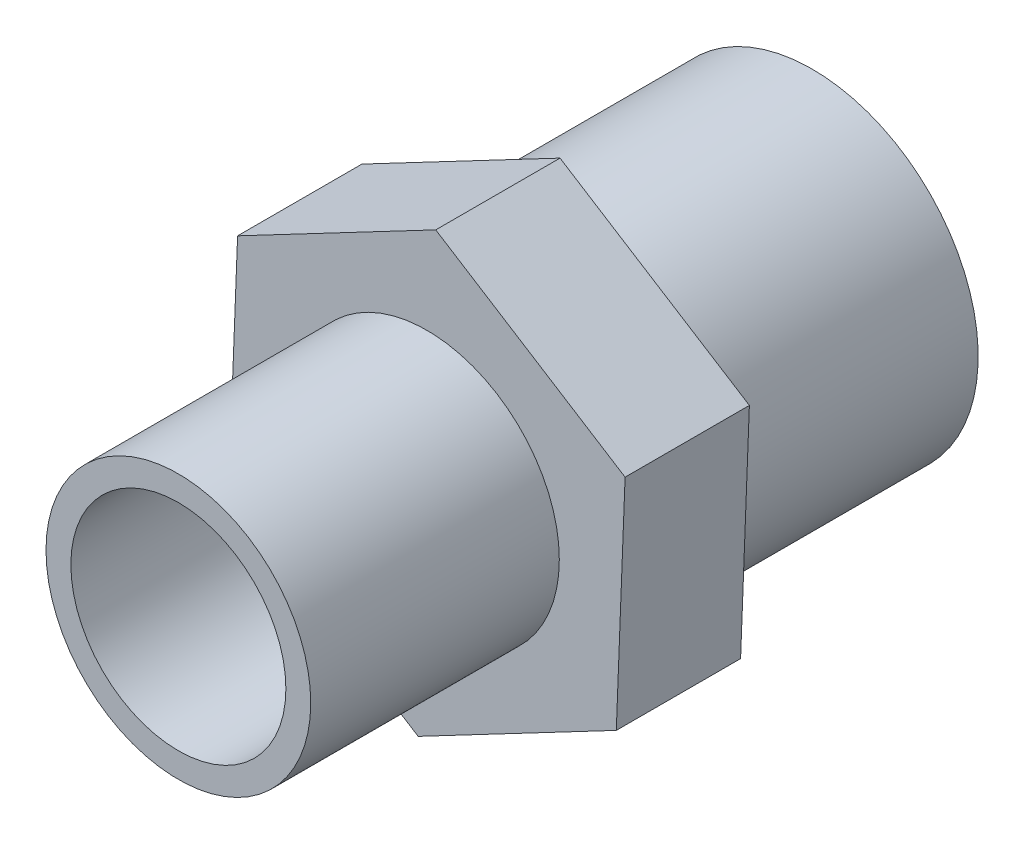
ISO-10303-21;
HEADER;
FILE_DESCRIPTION(('STEP AP214'),'2;1');
FILE_NAME('part.step','',(''),(''),'','','');
FILE_SCHEMA(('AUTOMOTIVE_DESIGN { 1 0 10303 214 1 1 1 1 }'));
ENDSEC;
DATA;
#1=APPLICATION_CONTEXT('core data for automotive mechanical design processes');
#2=APPLICATION_PROTOCOL_DEFINITION('international standard','automotive_design',2000,#1);
#3=PRODUCT_CONTEXT('',#1,'mechanical');
#4=PRODUCT('Part','Part','',(#3));
#5=PRODUCT_RELATED_PRODUCT_CATEGORY('part','',(#4));
#6=PRODUCT_DEFINITION_FORMATION('','',#4);
#7=PRODUCT_DEFINITION_CONTEXT('part definition',#1,'design');
#8=PRODUCT_DEFINITION('design','',#6,#7);
#9=PRODUCT_DEFINITION_SHAPE('','',#8);
#10=(LENGTH_UNIT() NAMED_UNIT(*) SI_UNIT(.MILLI.,.METRE.));
#11=(NAMED_UNIT(*) PLANE_ANGLE_UNIT() SI_UNIT($,.RADIAN.));
#12=(NAMED_UNIT(*) SI_UNIT($,.STERADIAN.) SOLID_ANGLE_UNIT());
#13=UNCERTAINTY_MEASURE_WITH_UNIT(LENGTH_MEASURE(1.E-05),#10,'distance_accuracy_value','');
#14=(GEOMETRIC_REPRESENTATION_CONTEXT(3) GLOBAL_UNCERTAINTY_ASSIGNED_CONTEXT((#13)) GLOBAL_UNIT_ASSIGNED_CONTEXT((#10,
#11,#12)) REPRESENTATION_CONTEXT('',''));
#15=CARTESIAN_POINT('',(0.,0.,0.));
#16=DIRECTION('',(0.,0.,1.));
#17=DIRECTION('',(1.,0.,0.));
#18=AXIS2_PLACEMENT_3D('',#15,#16,#17);
#19=CARTESIAN_POINT('',(15.2347430276917,-9.6126510357823,18.));
#20=DIRECTION('',(-0.999228586353057,0.0392712644928924,0.));
#21=DIRECTION('',(-0.0392712644928924,-0.999228586353057,0.));
#22=AXIS2_PLACEMENT_3D('',#19,#20,#21);
#23=PLANE('',#22);
#24=DIRECTION('',(0.0392712644928924,0.999228586353057,0.));
#25=VECTOR('',#24,1.);
#26=CARTESIAN_POINT('',(15.2347430276917,-9.6126510357823,8.));
#27=LINE('',#26,#25);
#28=CARTESIAN_POINT('',(15.2347430276917,-9.6126510357823,8.));
#29=VERTEX_POINT('',#28);
#30=CARTESIAN_POINT('',(15.9421715085481,8.38734896421769,8.));
#31=VERTEX_POINT('',#30);
#32=EDGE_CURVE('E142',#29,#31,#27,.T.);
#33=ORIENTED_EDGE('',*,*,#32,.T.);
#34=DIRECTION('',(0.,0.,-1.));
#35=VECTOR('',#34,1.);
#36=CARTESIAN_POINT('',(15.9421715085481,8.38734896421769,18.));
#37=LINE('',#36,#35);
#38=CARTESIAN_POINT('',(15.9421715085481,8.38734896421769,18.));
#39=VERTEX_POINT('',#38);
#40=EDGE_CURVE('E170',#39,#31,#37,.T.);
#41=ORIENTED_EDGE('',*,*,#40,.F.);
#42=DIRECTION('',(0.0392712644928924,0.999228586353057,0.));
#43=VECTOR('',#42,1.);
#44=CARTESIAN_POINT('',(15.2347430276917,-9.6126510357823,18.));
#45=LINE('',#44,#43);
#46=CARTESIAN_POINT('',(15.2347430276917,-9.6126510357823,18.));
#47=VERTEX_POINT('',#46);
#48=EDGE_CURVE('E159',#47,#39,#45,.T.);
#49=ORIENTED_EDGE('',*,*,#48,.F.);
#50=DIRECTION('',(0.,0.,-1.));
#51=VECTOR('',#50,1.);
#52=CARTESIAN_POINT('',(15.2347430276917,-9.6126510357823,18.));
#53=LINE('',#52,#51);
#54=EDGE_CURVE('E138',#47,#29,#53,.T.);
#55=ORIENTED_EDGE('',*,*,#54,.T.);
#56=EDGE_LOOP('',(#33,#41,#49,#55));
#57=FACE_BOUND('',#56,.T.);
#58=ADVANCED_FACE('F51',(#57),#23,.F.);
#59=CARTESIAN_POINT('',(15.9421715085481,8.38734896421769,18.));
#60=DIRECTION('',(-0.533624205866111,-0.845721707722914,0.));
#61=DIRECTION('',(0.845721707722914,-0.533624205866111,0.));
#62=AXIS2_PLACEMENT_3D('',#59,#60,#61);
#63=PLANE('',#62);
#64=DIRECTION('',(-0.845721707722914,0.533624205866111,0.));
#65=VECTOR('',#64,1.);
#66=CARTESIAN_POINT('',(15.9421715085481,8.38734896421769,8.));
#67=LINE('',#66,#65);
#68=CARTESIAN_POINT('',(0.707428480856438,18.,8.));
#69=VERTEX_POINT('',#68);
#70=EDGE_CURVE('E146',#31,#69,#67,.T.);
#71=ORIENTED_EDGE('',*,*,#70,.T.);
#72=DIRECTION('',(0.,0.,-1.));
#73=VECTOR('',#72,1.);
#74=CARTESIAN_POINT('',(0.707428480856438,18.,18.));
#75=LINE('',#74,#73);
#76=CARTESIAN_POINT('',(0.707428480856438,18.,18.));
#77=VERTEX_POINT('',#76);
#78=EDGE_CURVE('E166',#77,#69,#75,.T.);
#79=ORIENTED_EDGE('',*,*,#78,.F.);
#80=DIRECTION('',(-0.845721707722914,0.533624205866111,0.));
#81=VECTOR('',#80,1.);
#82=CARTESIAN_POINT('',(15.9421715085481,8.38734896421769,18.));
#83=LINE('',#82,#81);
#84=EDGE_CURVE('E107',#39,#77,#83,.T.);
#85=ORIENTED_EDGE('',*,*,#84,.F.);
#86=ORIENTED_EDGE('',*,*,#40,.T.);
#87=EDGE_LOOP('',(#71,#79,#85,#86));
#88=FACE_BOUND('',#87,.T.);
#89=ADVANCED_FACE('F209',(#88),#63,.F.);
#90=CARTESIAN_POINT('',(0.707428480856438,18.,18.));
#91=DIRECTION('',(0.465604380486946,-0.884992972215807,0.));
#92=DIRECTION('',(0.884992972215807,0.465604380486946,0.));
#93=AXIS2_PLACEMENT_3D('',#90,#91,#92);
#94=PLANE('',#93);
#95=DIRECTION('',(-0.884992972215806,-0.465604380486946,0.));
#96=VECTOR('',#95,1.);
#97=CARTESIAN_POINT('',(0.707428480856438,18.,8.));
#98=LINE('',#97,#96);
#99=CARTESIAN_POINT('',(-15.2347430276917,9.6126510357823,8.));
#100=VERTEX_POINT('',#99);
#101=EDGE_CURVE('E150',#69,#100,#98,.T.);
#102=ORIENTED_EDGE('',*,*,#101,.T.);
#103=DIRECTION('',(0.,0.,-1.));
#104=VECTOR('',#103,1.);
#105=CARTESIAN_POINT('',(-15.2347430276917,9.6126510357823,18.));
#106=LINE('',#105,#104);
#107=CARTESIAN_POINT('',(-15.2347430276917,9.6126510357823,18.));
#108=VERTEX_POINT('',#107);
#109=EDGE_CURVE('E131',#108,#100,#106,.T.);
#110=ORIENTED_EDGE('',*,*,#109,.F.);
#111=DIRECTION('',(-0.884992972215806,-0.465604380486946,0.));
#112=VECTOR('',#111,1.);
#113=CARTESIAN_POINT('',(0.707428480856438,18.,18.));
#114=LINE('',#113,#112);
#115=EDGE_CURVE('E120',#77,#108,#114,.T.);
#116=ORIENTED_EDGE('',*,*,#115,.F.);
#117=ORIENTED_EDGE('',*,*,#78,.T.);
#118=EDGE_LOOP('',(#102,#110,#116,#117));
#119=FACE_BOUND('',#118,.T.);
#120=ADVANCED_FACE('F215',(#119),#94,.F.);
#121=CARTESIAN_POINT('',(-15.2347430276917,9.6126510357823,18.));
#122=DIRECTION('',(0.999228586353057,-0.0392712644928927,0.));
#123=DIRECTION('',(0.0392712644928927,0.999228586353057,0.));
#124=AXIS2_PLACEMENT_3D('',#121,#122,#123);
#125=PLANE('',#124);
#126=DIRECTION('',(-0.0392712644928927,-0.999228586353057,0.));
#127=VECTOR('',#126,1.);
#128=CARTESIAN_POINT('',(-15.2347430276917,9.6126510357823,8.));
#129=LINE('',#128,#127);
#130=CARTESIAN_POINT('',(-15.9421715085481,-8.38734896421769,8.));
#131=VERTEX_POINT('',#130);
#132=EDGE_CURVE('E129',#100,#131,#129,.T.);
#133=ORIENTED_EDGE('',*,*,#132,.T.);
#134=DIRECTION('',(0.,0.,-1.));
#135=VECTOR('',#134,1.);
#136=CARTESIAN_POINT('',(-15.9421715085481,-8.38734896421769,18.));
#137=LINE('',#136,#135);
#138=CARTESIAN_POINT('',(-15.9421715085481,-8.38734896421769,18.));
#139=VERTEX_POINT('',#138);
#140=EDGE_CURVE('E126',#139,#131,#137,.T.);
#141=ORIENTED_EDGE('',*,*,#140,.F.);
#142=DIRECTION('',(-0.0392712644928927,-0.999228586353057,0.));
#143=VECTOR('',#142,1.);
#144=CARTESIAN_POINT('',(-15.2347430276917,9.6126510357823,18.));
#145=LINE('',#144,#143);
#146=EDGE_CURVE('E114',#108,#139,#145,.T.);
#147=ORIENTED_EDGE('',*,*,#146,.F.);
#148=ORIENTED_EDGE('',*,*,#109,.T.);
#149=EDGE_LOOP('',(#133,#141,#147,#148));
#150=FACE_BOUND('',#149,.T.);
#151=ADVANCED_FACE('F127',(#150),#125,.F.);
#152=CARTESIAN_POINT('',(-15.9421715085481,-8.38734896421769,18.));
#153=DIRECTION('',(0.533624205866111,0.845721707722914,0.));
#154=DIRECTION('',(-0.845721707722914,0.533624205866111,0.));
#155=AXIS2_PLACEMENT_3D('',#152,#153,#154);
#156=PLANE('',#155);
#157=DIRECTION('',(0.845721707722914,-0.533624205866111,0.));
#158=VECTOR('',#157,1.);
#159=CARTESIAN_POINT('',(-15.9421715085481,-8.38734896421769,8.));
#160=LINE('',#159,#158);
#161=CARTESIAN_POINT('',(-0.707428480856429,-18.,8.));
#162=VERTEX_POINT('',#161);
#163=EDGE_CURVE('E92',#131,#162,#160,.T.);
#164=ORIENTED_EDGE('',*,*,#163,.T.);
#165=DIRECTION('',(0.,0.,-1.));
#166=VECTOR('',#165,1.);
#167=CARTESIAN_POINT('',(-0.707428480856429,-18.,18.));
#168=LINE('',#167,#166);
#169=CARTESIAN_POINT('',(-0.707428480856429,-18.,18.));
#170=VERTEX_POINT('',#169);
#171=EDGE_CURVE('E132',#170,#162,#168,.T.);
#172=ORIENTED_EDGE('',*,*,#171,.F.);
#173=DIRECTION('',(0.845721707722914,-0.533624205866111,0.));
#174=VECTOR('',#173,1.);
#175=CARTESIAN_POINT('',(-15.9421715085481,-8.38734896421769,18.));
#176=LINE('',#175,#174);
#177=EDGE_CURVE('E118',#139,#170,#176,.T.);
#178=ORIENTED_EDGE('',*,*,#177,.F.);
#179=ORIENTED_EDGE('',*,*,#140,.T.);
#180=EDGE_LOOP('',(#164,#172,#178,#179));
#181=FACE_BOUND('',#180,.T.);
#182=ADVANCED_FACE('F134',(#181),#156,.F.);
#183=CARTESIAN_POINT('',(-0.707428480856429,-18.,18.));
#184=DIRECTION('',(-0.465604380486946,0.884992972215807,0.));
#185=DIRECTION('',(-0.884992972215807,-0.465604380486946,0.));
#186=AXIS2_PLACEMENT_3D('',#183,#184,#185);
#187=PLANE('',#186);
#188=DIRECTION('',(0.884992972215806,0.465604380486946,0.));
#189=VECTOR('',#188,1.);
#190=CARTESIAN_POINT('',(-0.707428480856429,-18.,8.));
#191=LINE('',#190,#189);
#192=EDGE_CURVE('E98',#162,#29,#191,.T.);
#193=ORIENTED_EDGE('',*,*,#192,.T.);
#194=ORIENTED_EDGE('',*,*,#54,.F.);
#195=DIRECTION('',(0.884992972215806,0.465604380486946,0.));
#196=VECTOR('',#195,1.);
#197=CARTESIAN_POINT('',(-0.707428480856429,-18.,18.));
#198=LINE('',#197,#196);
#199=EDGE_CURVE('E69',#170,#47,#198,.T.);
#200=ORIENTED_EDGE('',*,*,#199,.F.);
#201=ORIENTED_EDGE('',*,*,#171,.T.);
#202=EDGE_LOOP('',(#193,#194,#200,#201));
#203=FACE_BOUND('',#202,.T.);
#204=ADVANCED_FACE('F237',(#203),#187,.F.);
#205=CARTESIAN_POINT('',(0.,0.,18.));
#206=DIRECTION('',(0.,0.,1.));
#207=DIRECTION('',(1.,0.,0.));
#208=AXIS2_PLACEMENT_3D('',#205,#206,#207);
#209=PLANE('',#208);
#210=CARTESIAN_POINT('',(0.,0.,18.));
#211=DIRECTION('',(0.,0.,1.));
#212=DIRECTION('',(1.,0.,0.));
#213=AXIS2_PLACEMENT_3D('',#210,#211,#212);
#214=CIRCLE('',#213,10.65);
#215=CARTESIAN_POINT('',(10.65,0.,18.));
#216=VERTEX_POINT('',#215);
#217=EDGE_CURVE('E258',#216,#216,#214,.T.);
#218=ORIENTED_EDGE('',*,*,#217,.F.);
#219=EDGE_LOOP('',(#218));
#220=FACE_BOUND('',#219,.T.);
#221=ORIENTED_EDGE('',*,*,#48,.T.);
#222=ORIENTED_EDGE('',*,*,#84,.T.);
#223=ORIENTED_EDGE('',*,*,#115,.T.);
#224=ORIENTED_EDGE('',*,*,#146,.T.);
#225=ORIENTED_EDGE('',*,*,#177,.T.);
#226=ORIENTED_EDGE('',*,*,#199,.T.);
#227=EDGE_LOOP('',(#221,#222,#223,#224,#225,#226));
#228=FACE_BOUND('',#227,.T.);
#229=ADVANCED_FACE('F116',(#220,#228),#209,.T.);
#230=CARTESIAN_POINT('',(0.,0.,8.));
#231=DIRECTION('',(0.,0.,1.));
#232=DIRECTION('',(1.,0.,0.));
#233=AXIS2_PLACEMENT_3D('',#230,#231,#232);
#234=PLANE('',#233);
#235=CARTESIAN_POINT('',(0.,0.,8.));
#236=DIRECTION('',(0.,0.,1.));
#237=DIRECTION('',(1.,0.,0.));
#238=AXIS2_PLACEMENT_3D('',#235,#236,#237);
#239=CIRCLE('',#238,13.35);
#240=CARTESIAN_POINT('',(-13.35,0.,8.));
#241=VERTEX_POINT('',#240);
#242=EDGE_CURVE('E61',#241,#241,#239,.T.);
#243=ORIENTED_EDGE('',*,*,#242,.T.);
#244=EDGE_LOOP('',(#243));
#245=FACE_BOUND('',#244,.T.);
#246=ORIENTED_EDGE('',*,*,#32,.F.);
#247=ORIENTED_EDGE('',*,*,#192,.F.);
#248=ORIENTED_EDGE('',*,*,#163,.F.);
#249=ORIENTED_EDGE('',*,*,#132,.F.);
#250=ORIENTED_EDGE('',*,*,#101,.F.);
#251=ORIENTED_EDGE('',*,*,#70,.F.);
#252=EDGE_LOOP('',(#246,#247,#248,#249,#250,#251));
#253=FACE_BOUND('',#252,.T.);
#254=ADVANCED_FACE('F195',(#245,#253),#234,.F.);
#255=CARTESIAN_POINT('',(0.,0.,13.));
#256=DIRECTION('',(0.,0.,-1.));
#257=DIRECTION('',(-1.,0.,0.));
#258=AXIS2_PLACEMENT_3D('',#255,#256,#257);
#259=CYLINDRICAL_SURFACE('',#258,13.35);
#260=CARTESIAN_POINT('',(0.,0.,-13.));
#261=DIRECTION('',(0.,0.,1.));
#262=DIRECTION('',(1.,0.,0.));
#263=AXIS2_PLACEMENT_3D('',#260,#261,#262);
#264=CIRCLE('',#263,13.35);
#265=CARTESIAN_POINT('',(-13.35,0.,-13.));
#266=VERTEX_POINT('',#265);
#267=EDGE_CURVE('E177',#266,#266,#264,.T.);
#268=CARTESIAN_POINT('',(-13.35,0.,-13.));
#269=CARTESIAN_POINT('',(-13.35,0.,-12.78125));
#270=CARTESIAN_POINT('',(-13.35,0.,-12.5625));
#271=CARTESIAN_POINT('',(-13.35,0.,-12.125));
#272=CARTESIAN_POINT('',(-13.35,0.,-11.90625));
#273=CARTESIAN_POINT('',(-13.35,0.,-11.46875));
#274=CARTESIAN_POINT('',(-13.35,0.,-11.25));
#275=CARTESIAN_POINT('',(-13.35,0.,-10.8125));
#276=CARTESIAN_POINT('',(-13.35,0.,-10.59375));
#277=CARTESIAN_POINT('',(-13.35,0.,-10.15625));
#278=CARTESIAN_POINT('',(-13.35,0.,-9.9375));
#279=CARTESIAN_POINT('',(-13.35,0.,-9.5));
#280=CARTESIAN_POINT('',(-13.35,0.,-9.28125));
#281=CARTESIAN_POINT('',(-13.35,0.,-8.84375));
#282=CARTESIAN_POINT('',(-13.35,0.,-8.625));
#283=CARTESIAN_POINT('',(-13.35,0.,-8.1875));
#284=CARTESIAN_POINT('',(-13.35,0.,-7.96875));
#285=CARTESIAN_POINT('',(-13.35,0.,-7.53125));
#286=CARTESIAN_POINT('',(-13.35,0.,-7.3125));
#287=CARTESIAN_POINT('',(-13.35,0.,-6.875));
#288=CARTESIAN_POINT('',(-13.35,0.,-6.65625));
#289=CARTESIAN_POINT('',(-13.35,0.,-6.21875));
#290=CARTESIAN_POINT('',(-13.35,0.,-6.));
#291=CARTESIAN_POINT('',(-13.35,0.,-5.5625));
#292=CARTESIAN_POINT('',(-13.35,0.,-5.34375));
#293=CARTESIAN_POINT('',(-13.35,0.,-4.90625));
#294=CARTESIAN_POINT('',(-13.35,0.,-4.6875));
#295=CARTESIAN_POINT('',(-13.35,0.,-4.25));
#296=CARTESIAN_POINT('',(-13.35,0.,-4.03125));
#297=CARTESIAN_POINT('',(-13.35,0.,-3.59375));
#298=CARTESIAN_POINT('',(-13.35,0.,-3.375));
#299=CARTESIAN_POINT('',(-13.35,0.,-2.9375));
#300=CARTESIAN_POINT('',(-13.35,0.,-2.71875));
#301=CARTESIAN_POINT('',(-13.35,0.,-2.28125));
#302=CARTESIAN_POINT('',(-13.35,0.,-2.0625));
#303=CARTESIAN_POINT('',(-13.35,0.,-1.625));
#304=CARTESIAN_POINT('',(-13.35,0.,-1.40625));
#305=CARTESIAN_POINT('',(-13.35,0.,-0.968750000000001));
#306=CARTESIAN_POINT('',(-13.35,0.,-0.750000000000001));
#307=CARTESIAN_POINT('',(-13.35,0.,-0.3125));
#308=CARTESIAN_POINT('',(-13.35,0.,-0.0937500000000001));
#309=CARTESIAN_POINT('',(-13.35,0.,0.34375));
#310=CARTESIAN_POINT('',(-13.35,0.,0.562499999999999));
#311=CARTESIAN_POINT('',(-13.35,0.,0.999999999999999));
#312=CARTESIAN_POINT('',(-13.35,0.,1.21875));
#313=CARTESIAN_POINT('',(-13.35,0.,1.65625));
#314=CARTESIAN_POINT('',(-13.35,0.,1.875));
#315=CARTESIAN_POINT('',(-13.35,0.,2.3125));
#316=CARTESIAN_POINT('',(-13.35,0.,2.53125));
#317=CARTESIAN_POINT('',(-13.35,0.,2.96875));
#318=CARTESIAN_POINT('',(-13.35,0.,3.1875));
#319=CARTESIAN_POINT('',(-13.35,0.,3.625));
#320=CARTESIAN_POINT('',(-13.35,0.,3.84375));
#321=CARTESIAN_POINT('',(-13.35,0.,4.28125));
#322=CARTESIAN_POINT('',(-13.35,0.,4.5));
#323=CARTESIAN_POINT('',(-13.35,0.,4.9375));
#324=CARTESIAN_POINT('',(-13.35,0.,5.15625));
#325=CARTESIAN_POINT('',(-13.35,0.,5.59375));
#326=CARTESIAN_POINT('',(-13.35,0.,5.8125));
#327=CARTESIAN_POINT('',(-13.35,0.,6.25));
#328=CARTESIAN_POINT('',(-13.35,0.,6.46875));
#329=CARTESIAN_POINT('',(-13.35,0.,6.90625));
#330=CARTESIAN_POINT('',(-13.35,0.,7.125));
#331=CARTESIAN_POINT('',(-13.35,0.,7.5625));
#332=CARTESIAN_POINT('',(-13.35,0.,7.78125));
#333=CARTESIAN_POINT('',(-13.35,0.,8.));
#334=B_SPLINE_CURVE_WITH_KNOTS('',3,(#268,#269,#270,#271,#272,#273,#274,#275,#276,#277,#278,
#279,#280,#281,#282,#283,#284,#285,#286,#287,#288,#289,#290,#291,#292,#293,#294,#295,#296,#297,
#298,#299,#300,#301,#302,#303,#304,#305,#306,#307,#308,#309,#310,#311,#312,#313,#314,#315,#316,
#317,#318,#319,#320,#321,#322,#323,#324,#325,#326,#327,#328,#329,#330,#331,#332,#333),
.UNSPECIFIED.,.F.,.F.,(4,2,2,2,2,2,2,2,2,2,2,2,2,2,2,2,2,2,2,2,2,2,2,2,2,2,2,2,2,2,2,2,4),(0.,
0.656250000000001,1.3125,1.96875,2.625,3.28125,3.9375,4.59375,5.25,5.90625,6.5625,7.21875,7.875,
8.53125,9.1875,9.84375,10.5,11.15625,11.8125,12.46875,13.125,13.78125,14.4375,15.09375,15.75,
16.40625,17.0625,17.71875,18.375,19.03125,19.6875,20.34375,21.),.UNSPECIFIED.);
#335=EDGE_CURVE('BSEAM53',#266,#241,#334,.T.);
#336=ORIENTED_EDGE('',*,*,#267,.T.);
#337=ORIENTED_EDGE('',*,*,#242,.F.);
#338=ORIENTED_EDGE('',*,*,#335,.T.);
#339=ORIENTED_EDGE('',*,*,#335,.F.);
#340=EDGE_LOOP('',(#336,#338,#337,#339));
#341=FACE_BOUND('',#340,.T.);
#342=ADVANCED_FACE('F53',(#341),#259,.T.);
#343=CARTESIAN_POINT('',(0.,0.,13.));
#344=DIRECTION('',(0.,0.,-1.));
#345=DIRECTION('',(-1.,0.,0.));
#346=AXIS2_PLACEMENT_3D('',#343,#344,#345);
#347=CYLINDRICAL_SURFACE('',#346,11.35);
#348=CARTESIAN_POINT('',(0.,0.,-13.));
#349=DIRECTION('',(0.,0.,1.));
#350=DIRECTION('',(1.,0.,0.));
#351=AXIS2_PLACEMENT_3D('',#348,#349,#350);
#352=CIRCLE('',#351,11.35);
#353=CARTESIAN_POINT('',(-11.35,0.,-13.));
#354=VERTEX_POINT('',#353);
#355=EDGE_CURVE('E178',#354,#354,#352,.T.);
#356=CARTESIAN_POINT('',(0.,0.,8.));
#357=DIRECTION('',(0.,0.,1.));
#358=DIRECTION('',(1.,0.,0.));
#359=AXIS2_PLACEMENT_3D('',#356,#357,#358);
#360=CIRCLE('',#359,11.35);
#361=CARTESIAN_POINT('',(-11.35,0.,8.));
#362=VERTEX_POINT('',#361);
#363=EDGE_CURVE('E173',#362,#362,#360,.T.);
#364=CARTESIAN_POINT('',(-11.35,0.,-13.));
#365=CARTESIAN_POINT('',(-11.35,0.,-12.78125));
#366=CARTESIAN_POINT('',(-11.35,0.,-12.5625));
#367=CARTESIAN_POINT('',(-11.35,0.,-12.125));
#368=CARTESIAN_POINT('',(-11.35,0.,-11.90625));
#369=CARTESIAN_POINT('',(-11.35,0.,-11.46875));
#370=CARTESIAN_POINT('',(-11.35,0.,-11.25));
#371=CARTESIAN_POINT('',(-11.35,0.,-10.8125));
#372=CARTESIAN_POINT('',(-11.35,0.,-10.59375));
#373=CARTESIAN_POINT('',(-11.35,0.,-10.15625));
#374=CARTESIAN_POINT('',(-11.35,0.,-9.9375));
#375=CARTESIAN_POINT('',(-11.35,0.,-9.5));
#376=CARTESIAN_POINT('',(-11.35,0.,-9.28125));
#377=CARTESIAN_POINT('',(-11.35,0.,-8.84375));
#378=CARTESIAN_POINT('',(-11.35,0.,-8.625));
#379=CARTESIAN_POINT('',(-11.35,0.,-8.1875));
#380=CARTESIAN_POINT('',(-11.35,0.,-7.96875));
#381=CARTESIAN_POINT('',(-11.35,0.,-7.53125));
#382=CARTESIAN_POINT('',(-11.35,0.,-7.3125));
#383=CARTESIAN_POINT('',(-11.35,0.,-6.875));
#384=CARTESIAN_POINT('',(-11.35,0.,-6.65625));
#385=CARTESIAN_POINT('',(-11.35,0.,-6.21875));
#386=CARTESIAN_POINT('',(-11.35,0.,-6.));
#387=CARTESIAN_POINT('',(-11.35,0.,-5.5625));
#388=CARTESIAN_POINT('',(-11.35,0.,-5.34375));
#389=CARTESIAN_POINT('',(-11.35,0.,-4.90625));
#390=CARTESIAN_POINT('',(-11.35,0.,-4.6875));
#391=CARTESIAN_POINT('',(-11.35,0.,-4.25));
#392=CARTESIAN_POINT('',(-11.35,0.,-4.03125));
#393=CARTESIAN_POINT('',(-11.35,0.,-3.59375));
#394=CARTESIAN_POINT('',(-11.35,0.,-3.375));
#395=CARTESIAN_POINT('',(-11.35,0.,-2.9375));
#396=CARTESIAN_POINT('',(-11.35,0.,-2.71875));
#397=CARTESIAN_POINT('',(-11.35,0.,-2.28125));
#398=CARTESIAN_POINT('',(-11.35,0.,-2.0625));
#399=CARTESIAN_POINT('',(-11.35,0.,-1.625));
#400=CARTESIAN_POINT('',(-11.35,0.,-1.40625));
#401=CARTESIAN_POINT('',(-11.35,0.,-0.968750000000001));
#402=CARTESIAN_POINT('',(-11.35,0.,-0.750000000000001));
#403=CARTESIAN_POINT('',(-11.35,0.,-0.3125));
#404=CARTESIAN_POINT('',(-11.35,0.,-0.0937500000000001));
#405=CARTESIAN_POINT('',(-11.35,0.,0.34375));
#406=CARTESIAN_POINT('',(-11.35,0.,0.562499999999999));
#407=CARTESIAN_POINT('',(-11.35,0.,0.999999999999999));
#408=CARTESIAN_POINT('',(-11.35,0.,1.21875));
#409=CARTESIAN_POINT('',(-11.35,0.,1.65625));
#410=CARTESIAN_POINT('',(-11.35,0.,1.875));
#411=CARTESIAN_POINT('',(-11.35,0.,2.3125));
#412=CARTESIAN_POINT('',(-11.35,0.,2.53125));
#413=CARTESIAN_POINT('',(-11.35,0.,2.96875));
#414=CARTESIAN_POINT('',(-11.35,0.,3.1875));
#415=CARTESIAN_POINT('',(-11.35,0.,3.625));
#416=CARTESIAN_POINT('',(-11.35,0.,3.84375));
#417=CARTESIAN_POINT('',(-11.35,0.,4.28125));
#418=CARTESIAN_POINT('',(-11.35,0.,4.5));
#419=CARTESIAN_POINT('',(-11.35,0.,4.9375));
#420=CARTESIAN_POINT('',(-11.35,0.,5.15625));
#421=CARTESIAN_POINT('',(-11.35,0.,5.59375));
#422=CARTESIAN_POINT('',(-11.35,0.,5.8125));
#423=CARTESIAN_POINT('',(-11.35,0.,6.25));
#424=CARTESIAN_POINT('',(-11.35,0.,6.46875));
#425=CARTESIAN_POINT('',(-11.35,0.,6.90625));
#426=CARTESIAN_POINT('',(-11.35,0.,7.125));
#427=CARTESIAN_POINT('',(-11.35,0.,7.5625));
#428=CARTESIAN_POINT('',(-11.35,0.,7.78125));
#429=CARTESIAN_POINT('',(-11.35,0.,8.));
#430=B_SPLINE_CURVE_WITH_KNOTS('',3,(#364,#365,#366,#367,#368,#369,#370,#371,#372,#373,#374,
#375,#376,#377,#378,#379,#380,#381,#382,#383,#384,#385,#386,#387,#388,#389,#390,#391,#392,#393,
#394,#395,#396,#397,#398,#399,#400,#401,#402,#403,#404,#405,#406,#407,#408,#409,#410,#411,#412,
#413,#414,#415,#416,#417,#418,#419,#420,#421,#422,#423,#424,#425,#426,#427,#428,#429),
.UNSPECIFIED.,.F.,.F.,(4,2,2,2,2,2,2,2,2,2,2,2,2,2,2,2,2,2,2,2,2,2,2,2,2,2,2,2,2,2,2,2,4),(0.,
0.656250000000001,1.3125,1.96875,2.625,3.28125,3.9375,4.59375,5.25,5.90625,6.5625,7.21875,7.875,
8.53125,9.1875,9.84375,10.5,11.15625,11.8125,12.46875,13.125,13.78125,14.4375,15.09375,15.75,
16.40625,17.0625,17.71875,18.375,19.03125,19.6875,20.34375,21.),.UNSPECIFIED.);
#431=EDGE_CURVE('BSEAM188',#354,#362,#430,.T.);
#432=ORIENTED_EDGE('',*,*,#355,.F.);
#433=ORIENTED_EDGE('',*,*,#363,.T.);
#434=ORIENTED_EDGE('',*,*,#431,.T.);
#435=ORIENTED_EDGE('',*,*,#431,.F.);
#436=EDGE_LOOP('',(#432,#434,#433,#435));
#437=FACE_BOUND('',#436,.T.);
#438=ADVANCED_FACE('F188',(#437),#347,.F.);
#439=CARTESIAN_POINT('',(0.,0.,-13.));
#440=DIRECTION('',(0.,0.,1.));
#441=DIRECTION('',(1.,0.,0.));
#442=AXIS2_PLACEMENT_3D('',#439,#440,#441);
#443=PLANE('',#442);
#444=ORIENTED_EDGE('',*,*,#267,.F.);
#445=EDGE_LOOP('',(#444));
#446=FACE_BOUND('',#445,.T.);
#447=ORIENTED_EDGE('',*,*,#355,.T.);
#448=EDGE_LOOP('',(#447));
#449=FACE_BOUND('',#448,.T.);
#450=ADVANCED_FACE('F193',(#446,#449),#443,.F.);
#451=ORIENTED_EDGE('',*,*,#363,.F.);
#452=EDGE_LOOP('',(#451));
#453=FACE_BOUND('',#452,.T.);
#454=ADVANCED_FACE('F190',(#453),#234,.F.);
#455=CARTESIAN_POINT('',(0.,0.,38.));
#456=DIRECTION('',(0.,0.,1.));
#457=DIRECTION('',(1.,0.,0.));
#458=AXIS2_PLACEMENT_3D('',#455,#456,#457);
#459=PLANE('',#458);
#460=CARTESIAN_POINT('',(0.,0.,38.));
#461=DIRECTION('',(0.,0.,1.));
#462=DIRECTION('',(1.,0.,0.));
#463=AXIS2_PLACEMENT_3D('',#460,#461,#462);
#464=CIRCLE('',#463,10.65);
#465=CARTESIAN_POINT('',(10.65,0.,38.));
#466=VERTEX_POINT('',#465);
#467=EDGE_CURVE('E147',#466,#466,#464,.T.);
#468=ORIENTED_EDGE('',*,*,#467,.T.);
#469=EDGE_LOOP('',(#468));
#470=FACE_BOUND('',#469,.T.);
#471=CARTESIAN_POINT('',(0.,0.,38.));
#472=DIRECTION('',(0.,0.,1.));
#473=DIRECTION('',(1.,0.,0.));
#474=AXIS2_PLACEMENT_3D('',#471,#472,#473);
#475=CIRCLE('',#474,8.65);
#476=CARTESIAN_POINT('',(8.65,0.,38.));
#477=VERTEX_POINT('',#476);
#478=EDGE_CURVE('E262',#477,#477,#475,.T.);
#479=ORIENTED_EDGE('',*,*,#478,.F.);
#480=EDGE_LOOP('',(#479));
#481=FACE_BOUND('',#480,.T.);
#482=ADVANCED_FACE('F192',(#470,#481),#459,.T.);
#483=CARTESIAN_POINT('',(0.,0.,38.));
#484=DIRECTION('',(0.,0.,-1.));
#485=DIRECTION('',(-1.,0.,0.));
#486=AXIS2_PLACEMENT_3D('',#483,#484,#485);
#487=CYLINDRICAL_SURFACE('',#486,10.65);
#488=ORIENTED_EDGE('',*,*,#467,.F.);
#489=EDGE_LOOP('',(#488));
#490=FACE_BOUND('',#489,.T.);
#491=ORIENTED_EDGE('',*,*,#217,.T.);
#492=EDGE_LOOP('',(#491));
#493=FACE_BOUND('',#492,.T.);
#494=ADVANCED_FACE('F200',(#490,#493),#487,.T.);
#495=CARTESIAN_POINT('',(0.,0.,38.));
#496=DIRECTION('',(0.,0.,-1.));
#497=DIRECTION('',(-1.,0.,0.));
#498=AXIS2_PLACEMENT_3D('',#495,#496,#497);
#499=CYLINDRICAL_SURFACE('',#498,8.65);
#500=ORIENTED_EDGE('',*,*,#478,.T.);
#501=EDGE_LOOP('',(#500));
#502=FACE_BOUND('',#501,.T.);
#503=CARTESIAN_POINT('',(0.,0.,18.));
#504=DIRECTION('',(0.,0.,1.));
#505=DIRECTION('',(1.,0.,0.));
#506=AXIS2_PLACEMENT_3D('',#503,#504,#505);
#507=CIRCLE('',#506,8.65);
#508=CARTESIAN_POINT('',(8.65,0.,18.));
#509=VERTEX_POINT('',#508);
#510=EDGE_CURVE('E12',#509,#509,#507,.F.);
#511=ORIENTED_EDGE('',*,*,#510,.T.);
#512=EDGE_LOOP('',(#511));
#513=FACE_BOUND('',#512,.T.);
#514=ADVANCED_FACE('F270',(#502,#513),#499,.F.);
#515=ORIENTED_EDGE('',*,*,#510,.F.);
#516=EDGE_LOOP('',(#515));
#517=FACE_BOUND('',#516,.T.);
#518=ADVANCED_FACE('F244',(#517),#209,.T.);
#519=CLOSED_SHELL('',(#58,#89,#120,#151,#182,#204,#229,#254,#342,#438,#450,#454,#482,#494,#514,#518));
#520=MANIFOLD_SOLID_BREP('B2',#519);
#521=ADVANCED_BREP_SHAPE_REPRESENTATION('',(#18,#520),#14);
#522=SHAPE_DEFINITION_REPRESENTATION(#9,#521);
ENDSEC;
END-ISO-10303-21;
